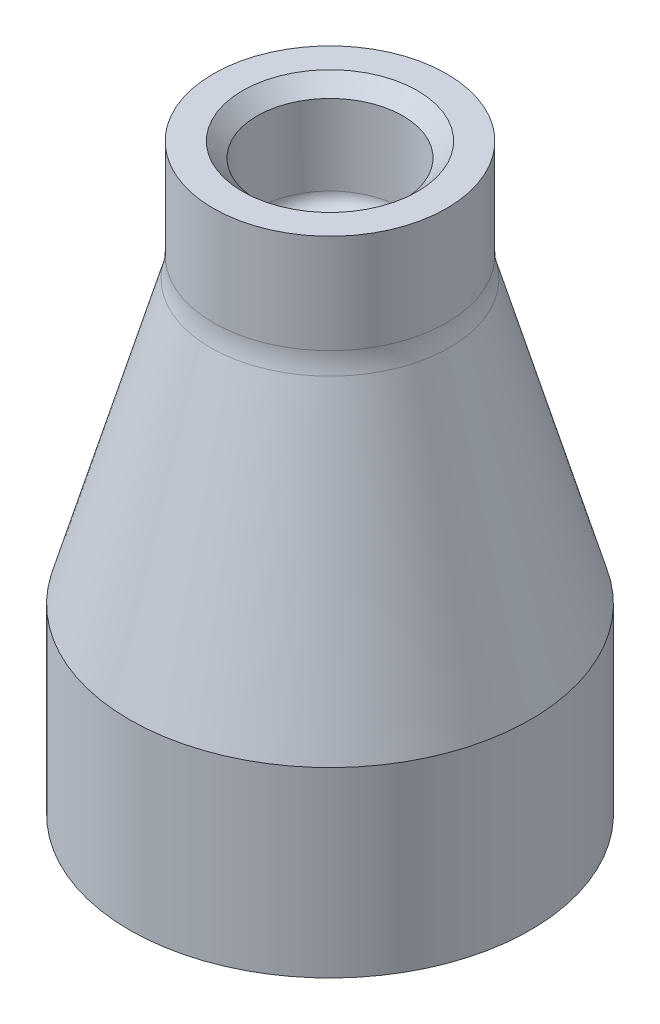
ISO-10303-21;
HEADER;
FILE_DESCRIPTION(('STEP AP214'),'2;1');
FILE_NAME('part.step','',(''),(''),'','','');
FILE_SCHEMA(('AUTOMOTIVE_DESIGN { 1 0 10303 214 1 1 1 1 }'));
ENDSEC;
DATA;
#1=APPLICATION_CONTEXT('core data for automotive mechanical design processes');
#2=APPLICATION_PROTOCOL_DEFINITION('international standard','automotive_design',2000,#1);
#3=PRODUCT_CONTEXT('',#1,'mechanical');
#4=PRODUCT('Part','Part','',(#3));
#5=PRODUCT_RELATED_PRODUCT_CATEGORY('part','',(#4));
#6=PRODUCT_DEFINITION_FORMATION('','',#4);
#7=PRODUCT_DEFINITION_CONTEXT('part definition',#1,'design');
#8=PRODUCT_DEFINITION('design','',#6,#7);
#9=PRODUCT_DEFINITION_SHAPE('','',#8);
#10=(LENGTH_UNIT() NAMED_UNIT(*) SI_UNIT(.MILLI.,.METRE.));
#11=(NAMED_UNIT(*) PLANE_ANGLE_UNIT() SI_UNIT($,.RADIAN.));
#12=(NAMED_UNIT(*) SI_UNIT($,.STERADIAN.) SOLID_ANGLE_UNIT());
#13=UNCERTAINTY_MEASURE_WITH_UNIT(LENGTH_MEASURE(1.E-05),#10,'distance_accuracy_value','');
#14=(GEOMETRIC_REPRESENTATION_CONTEXT(3) GLOBAL_UNCERTAINTY_ASSIGNED_CONTEXT((#13)) GLOBAL_UNIT_ASSIGNED_CONTEXT((#10,
#11,#12)) REPRESENTATION_CONTEXT('',''));
#15=CARTESIAN_POINT('',(0.,0.,0.));
#16=DIRECTION('',(0.,0.,1.));
#17=DIRECTION('',(1.,0.,0.));
#18=AXIS2_PLACEMENT_3D('',#15,#16,#17);
#19=CARTESIAN_POINT('',(0.,0.,0.));
#20=DIRECTION('',(0.,-1.,0.));
#21=DIRECTION('',(0.,0.,-1.));
#22=AXIS2_PLACEMENT_3D('',#19,#20,#21);
#23=PLANE('',#22);
#24=CARTESIAN_POINT('',(0.,0.,0.));
#25=DIRECTION('',(0.,-1.,0.));
#26=DIRECTION('',(0.,0.,-1.));
#27=AXIS2_PLACEMENT_3D('',#24,#25,#26);
#28=CIRCLE('',#27,12.);
#29=CARTESIAN_POINT('',(0.,0.,-12.));
#30=VERTEX_POINT('',#29);
#31=EDGE_CURVE('E67',#30,#30,#28,.T.);
#32=ORIENTED_EDGE('',*,*,#31,.T.);
#33=EDGE_LOOP('',(#32));
#34=FACE_BOUND('',#33,.T.);
#35=CARTESIAN_POINT('',(0.,0.,0.));
#36=DIRECTION('',(0.,1.,0.));
#37=DIRECTION('',(0.,0.,1.));
#38=AXIS2_PLACEMENT_3D('',#35,#36,#37);
#39=CIRCLE('',#38,16.);
#40=CARTESIAN_POINT('',(0.,0.,16.));
#41=VERTEX_POINT('',#40);
#42=EDGE_CURVE('E75',#41,#41,#39,.T.);
#43=ORIENTED_EDGE('',*,*,#42,.T.);
#44=EDGE_LOOP('',(#43));
#45=FACE_BOUND('',#44,.T.);
#46=ADVANCED_FACE('F43',(#34,#45),#23,.F.);
#47=CARTESIAN_POINT('',(0.,36.4440433212996,0.));
#48=DIRECTION('',(0.,1.,0.));
#49=DIRECTION('',(0.,0.,1.));
#50=AXIS2_PLACEMENT_3D('',#47,#48,#49);
#51=CYLINDRICAL_SURFACE('',#50,16.);
#52=CARTESIAN_POINT('',(0.,-13.5910369188578,0.));
#53=DIRECTION('',(0.,1.,0.));
#54=DIRECTION('',(0.,0.,1.));
#55=AXIS2_PLACEMENT_3D('',#52,#53,#54);
#56=CIRCLE('',#55,16.);
#57=CARTESIAN_POINT('',(0.,-13.5910369188578,16.));
#58=VERTEX_POINT('',#57);
#59=EDGE_CURVE('E51',#58,#58,#56,.T.);
#60=ORIENTED_EDGE('',*,*,#59,.T.);
#61=EDGE_LOOP('',(#60));
#62=FACE_BOUND('',#61,.T.);
#63=ORIENTED_EDGE('',*,*,#42,.F.);
#64=EDGE_LOOP('',(#63));
#65=FACE_BOUND('',#64,.T.);
#66=ADVANCED_FACE('F105',(#62,#65),#51,.T.);
#67=CARTESIAN_POINT('',(0.,-55.,0.));
#68=DIRECTION('',(0.,-1.,0.));
#69=DIRECTION('',(0.,0.,-1.));
#70=AXIS2_PLACEMENT_3D('',#67,#68,#69);
#71=CONICAL_SURFACE('',#70,27.5,0.279949822523791);
#72=CARTESIAN_POINT('',(0.,-16.3541111676562,0.));
#73=DIRECTION('',(0.,-1.,0.));
#74=DIRECTION('',(0.,0.,-1.));
#75=AXIS2_PLACEMENT_3D('',#72,#73,#74);
#76=CIRCLE('',#75,16.3893069607012);
#77=CARTESIAN_POINT('',(0.,-16.3541111676562,-16.3893069607012));
#78=VERTEX_POINT('',#77);
#79=EDGE_CURVE('E10',#78,#78,#76,.T.);
#80=ORIENTED_EDGE('',*,*,#79,.T.);
#81=EDGE_LOOP('',(#80));
#82=FACE_BOUND('',#81,.T.);
#83=CARTESIAN_POINT('',(0.,-55.,0.));
#84=DIRECTION('',(0.,1.,0.));
#85=DIRECTION('',(0.,0.,1.));
#86=AXIS2_PLACEMENT_3D('',#83,#84,#85);
#87=CIRCLE('',#86,27.5);
#88=CARTESIAN_POINT('',(0.,-55.,27.5));
#89=VERTEX_POINT('',#88);
#90=EDGE_CURVE('E79',#89,#89,#87,.T.);
#91=ORIENTED_EDGE('',*,*,#90,.T.);
#92=EDGE_LOOP('',(#91));
#93=FACE_BOUND('',#92,.T.);
#94=ADVANCED_FACE('F101',(#82,#93),#71,.T.);
#95=CARTESIAN_POINT('',(0.,36.4440433212996,0.));
#96=DIRECTION('',(0.,1.,0.));
#97=DIRECTION('',(0.,0.,1.));
#98=AXIS2_PLACEMENT_3D('',#95,#96,#97);
#99=CYLINDRICAL_SURFACE('',#98,27.5);
#100=ORIENTED_EDGE('',*,*,#90,.F.);
#101=EDGE_LOOP('',(#100));
#102=FACE_BOUND('',#101,.T.);
#103=CARTESIAN_POINT('',(0.,-80.,0.));
#104=DIRECTION('',(0.,1.,0.));
#105=DIRECTION('',(0.,0.,1.));
#106=AXIS2_PLACEMENT_3D('',#103,#104,#105);
#107=CIRCLE('',#106,27.5);
#108=CARTESIAN_POINT('',(0.,-80.,27.5));
#109=VERTEX_POINT('',#108);
#110=EDGE_CURVE('E83',#109,#109,#107,.T.);
#111=ORIENTED_EDGE('',*,*,#110,.T.);
#112=EDGE_LOOP('',(#111));
#113=FACE_BOUND('',#112,.T.);
#114=ADVANCED_FACE('F88',(#102,#113),#99,.T.);
#115=CARTESIAN_POINT('',(27.5,-80.,0.));
#116=DIRECTION('',(0.,1.,0.));
#117=DIRECTION('',(0.,0.,1.));
#118=AXIS2_PLACEMENT_3D('',#115,#116,#117);
#119=PLANE('',#118);
#120=ORIENTED_EDGE('',*,*,#110,.F.);
#121=EDGE_LOOP('',(#120));
#122=FACE_BOUND('',#121,.T.);
#123=ADVANCED_FACE('F90',(#122),#119,.F.);
#124=CARTESIAN_POINT('',(0.,-15.,0.));
#125=DIRECTION('',(0.,1.,0.));
#126=DIRECTION('',(0.,0.,1.));
#127=AXIS2_PLACEMENT_3D('',#124,#125,#126);
#128=CYLINDRICAL_SURFACE('',#127,10.);
#129=CARTESIAN_POINT('',(0.,-13.,0.));
#130=DIRECTION('',(0.,1.,0.));
#131=DIRECTION('',(0.,0.,1.));
#132=AXIS2_PLACEMENT_3D('',#129,#130,#131);
#133=CIRCLE('',#132,10.);
#134=CARTESIAN_POINT('',(0.,-13.,10.));
#135=VERTEX_POINT('',#134);
#136=EDGE_CURVE('E56',#135,#135,#133,.F.);
#137=ORIENTED_EDGE('',*,*,#136,.T.);
#138=EDGE_LOOP('',(#137));
#139=FACE_BOUND('',#138,.T.);
#140=CARTESIAN_POINT('',(0.,-2.00000000000002,0.));
#141=DIRECTION('',(0.,-1.,0.));
#142=DIRECTION('',(0.,0.,-1.));
#143=AXIS2_PLACEMENT_3D('',#140,#141,#142);
#144=CIRCLE('',#143,10.);
#145=CARTESIAN_POINT('',(0.,-2.00000000000002,-10.));
#146=VERTEX_POINT('',#145);
#147=EDGE_CURVE('E71',#146,#146,#144,.F.);
#148=ORIENTED_EDGE('',*,*,#147,.T.);
#149=EDGE_LOOP('',(#148));
#150=FACE_BOUND('',#149,.T.);
#151=ADVANCED_FACE('F92',(#139,#150),#128,.F.);
#152=CARTESIAN_POINT('',(0.,-15.,0.));
#153=DIRECTION('',(0.,1.,0.));
#154=DIRECTION('',(0.,0.,1.));
#155=AXIS2_PLACEMENT_3D('',#152,#153,#154);
#156=PLANE('',#155);
#157=CARTESIAN_POINT('',(0.,-15.,0.));
#158=DIRECTION('',(0.,1.,0.));
#159=DIRECTION('',(0.,0.,1.));
#160=AXIS2_PLACEMENT_3D('',#157,#158,#159);
#161=CIRCLE('',#160,8.);
#162=CARTESIAN_POINT('',(0.,-15.,8.));
#163=VERTEX_POINT('',#162);
#164=EDGE_CURVE('E61',#163,#163,#161,.T.);
#165=ORIENTED_EDGE('',*,*,#164,.T.);
#166=EDGE_LOOP('',(#165));
#167=FACE_BOUND('',#166,.T.);
#168=ADVANCED_FACE('F98',(#167),#156,.T.);
#169=CARTESIAN_POINT('',(0.,-2.00000000000002,0.));
#170=DIRECTION('',(0.,1.,0.));
#171=DIRECTION('',(0.,0.,1.));
#172=AXIS2_PLACEMENT_3D('',#169,#170,#171);
#173=CONICAL_SURFACE('',#172,10.,0.78539816339745);
#174=ORIENTED_EDGE('',*,*,#31,.F.);
#175=EDGE_LOOP('',(#174));
#176=FACE_BOUND('',#175,.T.);
#177=ORIENTED_EDGE('',*,*,#147,.F.);
#178=EDGE_LOOP('',(#177));
#179=FACE_BOUND('',#178,.T.);
#180=ADVANCED_FACE('F116',(#176,#179),#173,.F.);
#181=CARTESIAN_POINT('',(0.,-13.,0.));
#182=DIRECTION('',(0.,1.,0.));
#183=DIRECTION('',(0.,0.,1.));
#184=AXIS2_PLACEMENT_3D('',#181,#182,#183);
#185=TOROIDAL_SURFACE('',#184,8.,2.);
#186=ORIENTED_EDGE('',*,*,#136,.F.);
#187=EDGE_LOOP('',(#186));
#188=FACE_BOUND('',#187,.T.);
#189=ORIENTED_EDGE('',*,*,#164,.F.);
#190=EDGE_LOOP('',(#189));
#191=FACE_BOUND('',#190,.T.);
#192=ADVANCED_FACE('F120',(#188,#191),#185,.F.);
#193=CARTESIAN_POINT('',(0.,-13.5910369188578,0.));
#194=DIRECTION('',(0.,1.,0.));
#195=DIRECTION('',(0.,0.,1.));
#196=AXIS2_PLACEMENT_3D('',#193,#194,#195);
#197=TOROIDAL_SURFACE('',#196,26.,10.);
#198=ORIENTED_EDGE('',*,*,#79,.F.);
#199=EDGE_LOOP('',(#198));
#200=FACE_BOUND('',#199,.T.);
#201=ORIENTED_EDGE('',*,*,#59,.F.);
#202=EDGE_LOOP('',(#201));
#203=FACE_BOUND('',#202,.T.);
#204=ADVANCED_FACE('F45',(#200,#203),#197,.F.);
#205=CLOSED_SHELL('',(#46,#66,#94,#114,#123,#151,#168,#180,#192,#204));
#206=MANIFOLD_SOLID_BREP('B2',#205);
#207=ADVANCED_BREP_SHAPE_REPRESENTATION('',(#18,#206),#14);
#208=SHAPE_DEFINITION_REPRESENTATION(#9,#207);
ENDSEC;
END-ISO-10303-21;
